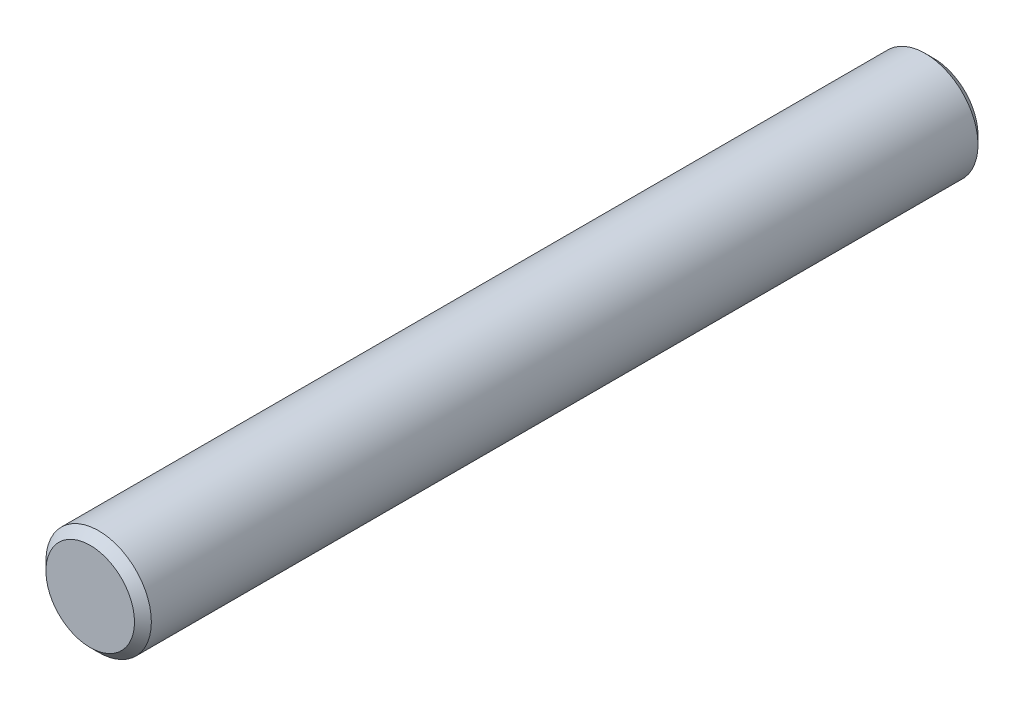
ISO-10303-21;
HEADER;
FILE_DESCRIPTION(('STEP AP214'),'2;1');
FILE_NAME('part.step','',(''),(''),'','','');
FILE_SCHEMA(('AUTOMOTIVE_DESIGN { 1 0 10303 214 1 1 1 1 }'));
ENDSEC;
DATA;
#1=APPLICATION_CONTEXT('core data for automotive mechanical design processes');
#2=APPLICATION_PROTOCOL_DEFINITION('international standard','automotive_design',2000,#1);
#3=PRODUCT_CONTEXT('',#1,'mechanical');
#4=PRODUCT('Part','Part','',(#3));
#5=PRODUCT_RELATED_PRODUCT_CATEGORY('part','',(#4));
#6=PRODUCT_DEFINITION_FORMATION('','',#4);
#7=PRODUCT_DEFINITION_CONTEXT('part definition',#1,'design');
#8=PRODUCT_DEFINITION('design','',#6,#7);
#9=PRODUCT_DEFINITION_SHAPE('','',#8);
#10=(LENGTH_UNIT() NAMED_UNIT(*) SI_UNIT(.MILLI.,.METRE.));
#11=(NAMED_UNIT(*) PLANE_ANGLE_UNIT() SI_UNIT($,.RADIAN.));
#12=(NAMED_UNIT(*) SI_UNIT($,.STERADIAN.) SOLID_ANGLE_UNIT());
#13=UNCERTAINTY_MEASURE_WITH_UNIT(LENGTH_MEASURE(1.E-05),#10,'distance_accuracy_value','');
#14=(GEOMETRIC_REPRESENTATION_CONTEXT(3) GLOBAL_UNCERTAINTY_ASSIGNED_CONTEXT((#13)) GLOBAL_UNIT_ASSIGNED_CONTEXT((#10,
#11,#12)) REPRESENTATION_CONTEXT('',''));
#15=CARTESIAN_POINT('',(0.,0.,0.));
#16=DIRECTION('',(0.,0.,1.));
#17=DIRECTION('',(1.,0.,0.));
#18=AXIS2_PLACEMENT_3D('',#15,#16,#17);
#19=CARTESIAN_POINT('',(0.,0.,200.));
#20=DIRECTION('',(0.,0.,-1.));
#21=DIRECTION('',(-1.,0.,0.));
#22=AXIS2_PLACEMENT_3D('',#19,#20,#21);
#23=CYLINDRICAL_SURFACE('',#22,12.5);
#24=CARTESIAN_POINT('',(0.,0.,2.00000000000003));
#25=DIRECTION('',(0.,0.,1.));
#26=DIRECTION('',(1.,0.,0.));
#27=AXIS2_PLACEMENT_3D('',#24,#25,#26);
#28=CIRCLE('',#27,12.5);
#29=CARTESIAN_POINT('',(12.5,0.,2.00000000000003));
#30=VERTEX_POINT('',#29);
#31=EDGE_CURVE('E49',#30,#30,#28,.T.);
#32=ORIENTED_EDGE('',*,*,#31,.T.);
#33=EDGE_LOOP('',(#32));
#34=FACE_BOUND('',#33,.T.);
#35=CARTESIAN_POINT('',(0.,0.,198.));
#36=DIRECTION('',(0.,0.,1.));
#37=DIRECTION('',(1.,0.,0.));
#38=AXIS2_PLACEMENT_3D('',#35,#36,#37);
#39=CIRCLE('',#38,12.5);
#40=CARTESIAN_POINT('',(12.5,0.,198.));
#41=VERTEX_POINT('',#40);
#42=EDGE_CURVE('E53',#41,#41,#39,.F.);
#43=ORIENTED_EDGE('',*,*,#42,.T.);
#44=EDGE_LOOP('',(#43));
#45=FACE_BOUND('',#44,.T.);
#46=ADVANCED_FACE('F37',(#34,#45),#23,.T.);
#47=CARTESIAN_POINT('',(0.,0.,200.));
#48=DIRECTION('',(0.,0.,1.));
#49=DIRECTION('',(1.,0.,0.));
#50=AXIS2_PLACEMENT_3D('',#47,#48,#49);
#51=PLANE('',#50);
#52=CARTESIAN_POINT('',(0.,0.,200.));
#53=DIRECTION('',(0.,0.,1.));
#54=DIRECTION('',(1.,0.,0.));
#55=AXIS2_PLACEMENT_3D('',#52,#53,#54);
#56=CIRCLE('',#55,10.5);
#57=CARTESIAN_POINT('',(10.5,0.,200.));
#58=VERTEX_POINT('',#57);
#59=EDGE_CURVE('E10',#58,#58,#56,.T.);
#60=ORIENTED_EDGE('',*,*,#59,.T.);
#61=EDGE_LOOP('',(#60));
#62=FACE_BOUND('',#61,.T.);
#63=ADVANCED_FACE('F69',(#62),#51,.T.);
#64=CARTESIAN_POINT('',(0.,0.,0.));
#65=DIRECTION('',(0.,0.,1.));
#66=DIRECTION('',(1.,0.,0.));
#67=AXIS2_PLACEMENT_3D('',#64,#65,#66);
#68=PLANE('',#67);
#69=CARTESIAN_POINT('',(0.,0.,0.));
#70=DIRECTION('',(0.,0.,1.));
#71=DIRECTION('',(1.,0.,0.));
#72=AXIS2_PLACEMENT_3D('',#69,#70,#71);
#73=CIRCLE('',#72,10.5);
#74=CARTESIAN_POINT('',(10.5,0.,0.));
#75=VERTEX_POINT('',#74);
#76=EDGE_CURVE('E45',#75,#75,#73,.F.);
#77=ORIENTED_EDGE('',*,*,#76,.T.);
#78=EDGE_LOOP('',(#77));
#79=FACE_BOUND('',#78,.T.);
#80=ADVANCED_FACE('F66',(#79),#68,.F.);
#81=CARTESIAN_POINT('',(0.,0.,2.00000000000003));
#82=DIRECTION('',(0.,0.,1.));
#83=DIRECTION('',(1.,0.,0.));
#84=AXIS2_PLACEMENT_3D('',#81,#82,#83);
#85=CONICAL_SURFACE('',#84,12.5,0.785398163397446);
#86=ORIENTED_EDGE('',*,*,#76,.F.);
#87=EDGE_LOOP('',(#86));
#88=FACE_BOUND('',#87,.T.);
#89=ORIENTED_EDGE('',*,*,#31,.F.);
#90=EDGE_LOOP('',(#89));
#91=FACE_BOUND('',#90,.T.);
#92=ADVANCED_FACE('F62',(#88,#91),#85,.T.);
#93=CARTESIAN_POINT('',(0.,0.,200.));
#94=DIRECTION('',(0.,0.,-1.));
#95=DIRECTION('',(-1.,0.,0.));
#96=AXIS2_PLACEMENT_3D('',#93,#94,#95);
#97=CONICAL_SURFACE('',#96,10.5,0.785398163397446);
#98=ORIENTED_EDGE('',*,*,#42,.F.);
#99=EDGE_LOOP('',(#98));
#100=FACE_BOUND('',#99,.T.);
#101=ORIENTED_EDGE('',*,*,#59,.F.);
#102=EDGE_LOOP('',(#101));
#103=FACE_BOUND('',#102,.T.);
#104=ADVANCED_FACE('F40',(#100,#103),#97,.T.);
#105=CLOSED_SHELL('',(#46,#63,#80,#92,#104));
#106=MANIFOLD_SOLID_BREP('B2',#105);
#107=ADVANCED_BREP_SHAPE_REPRESENTATION('',(#18,#106),#14);
#108=SHAPE_DEFINITION_REPRESENTATION(#9,#107);
ENDSEC;
END-ISO-10303-21;
